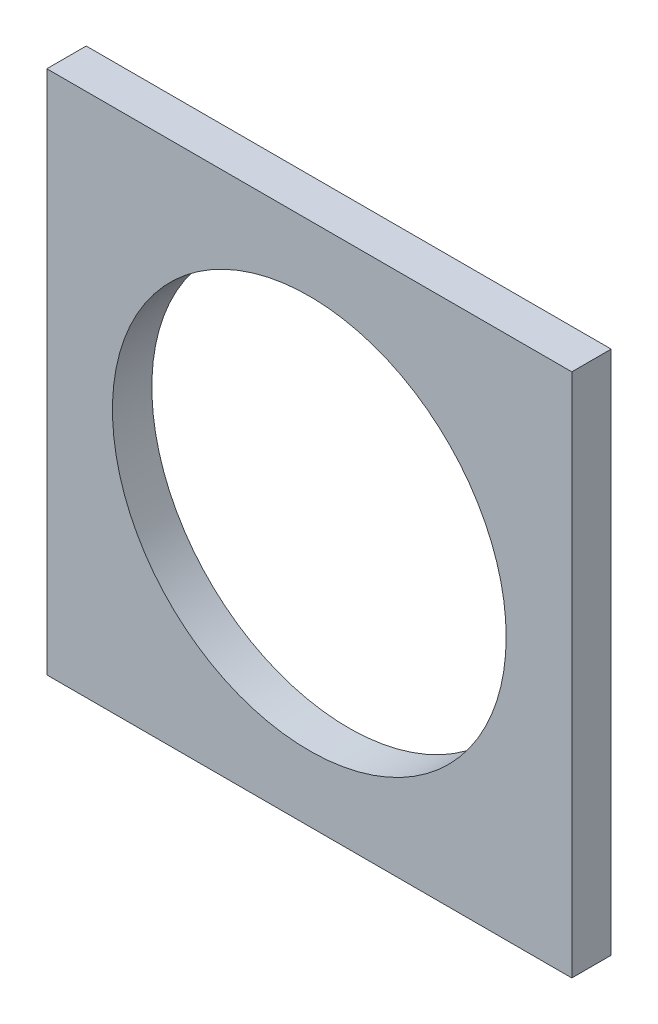
ISO-10303-21;
HEADER;
FILE_DESCRIPTION(('STEP AP214'),'2;1');
FILE_NAME('part.step','',(''),(''),'','','');
FILE_SCHEMA(('AUTOMOTIVE_DESIGN { 1 0 10303 214 1 1 1 1 }'));
ENDSEC;
DATA;
#1=APPLICATION_CONTEXT('core data for automotive mechanical design processes');
#2=APPLICATION_PROTOCOL_DEFINITION('international standard','automotive_design',2000,#1);
#3=PRODUCT_CONTEXT('',#1,'mechanical');
#4=PRODUCT('Part','Part','',(#3));
#5=PRODUCT_RELATED_PRODUCT_CATEGORY('part','',(#4));
#6=PRODUCT_DEFINITION_FORMATION('','',#4);
#7=PRODUCT_DEFINITION_CONTEXT('part definition',#1,'design');
#8=PRODUCT_DEFINITION('design','',#6,#7);
#9=PRODUCT_DEFINITION_SHAPE('','',#8);
#10=(LENGTH_UNIT() NAMED_UNIT(*) SI_UNIT(.MILLI.,.METRE.));
#11=(NAMED_UNIT(*) PLANE_ANGLE_UNIT() SI_UNIT($,.RADIAN.));
#12=(NAMED_UNIT(*) SI_UNIT($,.STERADIAN.) SOLID_ANGLE_UNIT());
#13=UNCERTAINTY_MEASURE_WITH_UNIT(LENGTH_MEASURE(1.E-05),#10,'distance_accuracy_value','');
#14=(GEOMETRIC_REPRESENTATION_CONTEXT(3) GLOBAL_UNCERTAINTY_ASSIGNED_CONTEXT((#13)) GLOBAL_UNIT_ASSIGNED_CONTEXT((#10,
#11,#12)) REPRESENTATION_CONTEXT('',''));
#15=CARTESIAN_POINT('',(0.,0.,0.));
#16=DIRECTION('',(0.,0.,1.));
#17=DIRECTION('',(1.,0.,0.));
#18=AXIS2_PLACEMENT_3D('',#15,#16,#17);
#19=CARTESIAN_POINT('',(20.,20.,3.));
#20=DIRECTION('',(0.,0.,-1.));
#21=DIRECTION('',(-1.,0.,0.));
#22=AXIS2_PLACEMENT_3D('',#19,#20,#21);
#23=PLANE('',#22);
#24=DIRECTION('',(0.,1.,0.));
#25=VECTOR('',#24,1.);
#26=CARTESIAN_POINT('',(20.,-20.,3.));
#27=LINE('',#26,#25);
#28=CARTESIAN_POINT('',(20.,-20.,3.));
#29=VERTEX_POINT('',#28);
#30=CARTESIAN_POINT('',(20.,20.,3.));
#31=VERTEX_POINT('',#30);
#32=EDGE_CURVE('E85',#29,#31,#27,.T.);
#33=ORIENTED_EDGE('',*,*,#32,.T.);
#34=DIRECTION('',(-1.,0.,0.));
#35=VECTOR('',#34,1.);
#36=CARTESIAN_POINT('',(-20.,20.,3.));
#37=LINE('',#36,#35);
#38=CARTESIAN_POINT('',(-20.,20.,3.));
#39=VERTEX_POINT('',#38);
#40=EDGE_CURVE('E80',#31,#39,#37,.T.);
#41=ORIENTED_EDGE('',*,*,#40,.T.);
#42=DIRECTION('',(0.,-1.,0.));
#43=VECTOR('',#42,1.);
#44=CARTESIAN_POINT('',(-20.,-20.,3.));
#45=LINE('',#44,#43);
#46=CARTESIAN_POINT('',(-20.,-20.,3.));
#47=VERTEX_POINT('',#46);
#48=EDGE_CURVE('E83',#39,#47,#45,.T.);
#49=ORIENTED_EDGE('',*,*,#48,.T.);
#50=DIRECTION('',(1.,0.,0.));
#51=VECTOR('',#50,1.);
#52=CARTESIAN_POINT('',(-20.,-20.,3.));
#53=LINE('',#52,#51);
#54=EDGE_CURVE('E50',#47,#29,#53,.T.);
#55=ORIENTED_EDGE('',*,*,#54,.T.);
#56=EDGE_LOOP('',(#33,#41,#49,#55));
#57=FACE_BOUND('',#56,.T.);
#58=CARTESIAN_POINT('',(0.,0.,3.));
#59=DIRECTION('',(0.,0.,1.));
#60=DIRECTION('',(1.,0.,0.));
#61=AXIS2_PLACEMENT_3D('',#58,#59,#60);
#62=CIRCLE('',#61,15.);
#63=CARTESIAN_POINT('',(15.,0.,3.));
#64=VERTEX_POINT('',#63);
#65=EDGE_CURVE('E100',#64,#64,#62,.T.);
#66=ORIENTED_EDGE('',*,*,#65,.F.);
#67=EDGE_LOOP('',(#66));
#68=FACE_BOUND('',#67,.T.);
#69=ADVANCED_FACE('F33',(#57,#68),#23,.F.);
#70=CARTESIAN_POINT('',(20.,20.,0.));
#71=DIRECTION('',(0.,0.,-1.));
#72=DIRECTION('',(-1.,0.,0.));
#73=AXIS2_PLACEMENT_3D('',#70,#71,#72);
#74=PLANE('',#73);
#75=DIRECTION('',(0.,1.,0.));
#76=VECTOR('',#75,1.);
#77=CARTESIAN_POINT('',(20.,-20.,0.));
#78=LINE('',#77,#76);
#79=CARTESIAN_POINT('',(20.,-20.,0.));
#80=VERTEX_POINT('',#79);
#81=CARTESIAN_POINT('',(20.,20.,0.));
#82=VERTEX_POINT('',#81);
#83=EDGE_CURVE('E97',#80,#82,#78,.T.);
#84=ORIENTED_EDGE('',*,*,#83,.F.);
#85=DIRECTION('',(1.,0.,0.));
#86=VECTOR('',#85,1.);
#87=CARTESIAN_POINT('',(-20.,-20.,0.));
#88=LINE('',#87,#86);
#89=CARTESIAN_POINT('',(-20.,-20.,0.));
#90=VERTEX_POINT('',#89);
#91=EDGE_CURVE('E73',#90,#80,#88,.T.);
#92=ORIENTED_EDGE('',*,*,#91,.F.);
#93=DIRECTION('',(0.,-1.,0.));
#94=VECTOR('',#93,1.);
#95=CARTESIAN_POINT('',(-20.,-20.,0.));
#96=LINE('',#95,#94);
#97=CARTESIAN_POINT('',(-20.,20.,0.));
#98=VERTEX_POINT('',#97);
#99=EDGE_CURVE('E67',#98,#90,#96,.T.);
#100=ORIENTED_EDGE('',*,*,#99,.F.);
#101=DIRECTION('',(-1.,0.,0.));
#102=VECTOR('',#101,1.);
#103=CARTESIAN_POINT('',(-20.,20.,0.));
#104=LINE('',#103,#102);
#105=EDGE_CURVE('E89',#82,#98,#104,.T.);
#106=ORIENTED_EDGE('',*,*,#105,.F.);
#107=EDGE_LOOP('',(#84,#92,#100,#106));
#108=FACE_BOUND('',#107,.T.);
#109=CARTESIAN_POINT('',(0.,0.,0.));
#110=DIRECTION('',(0.,0.,1.));
#111=DIRECTION('',(1.,0.,0.));
#112=AXIS2_PLACEMENT_3D('',#109,#110,#111);
#113=CIRCLE('',#112,15.);
#114=CARTESIAN_POINT('',(15.,0.,0.));
#115=VERTEX_POINT('',#114);
#116=EDGE_CURVE('E112',#115,#115,#113,.T.);
#117=ORIENTED_EDGE('',*,*,#116,.T.);
#118=EDGE_LOOP('',(#117));
#119=FACE_BOUND('',#118,.T.);
#120=ADVANCED_FACE('F108',(#108,#119),#74,.T.);
#121=CARTESIAN_POINT('',(20.,-20.,3.));
#122=DIRECTION('',(-1.,0.,0.));
#123=DIRECTION('',(0.,0.,1.));
#124=AXIS2_PLACEMENT_3D('',#121,#122,#123);
#125=PLANE('',#124);
#126=ORIENTED_EDGE('',*,*,#83,.T.);
#127=DIRECTION('',(0.,0.,-1.));
#128=VECTOR('',#127,1.);
#129=CARTESIAN_POINT('',(20.,20.,3.));
#130=LINE('',#129,#128);
#131=EDGE_CURVE('E11',#31,#82,#130,.T.);
#132=ORIENTED_EDGE('',*,*,#131,.F.);
#133=ORIENTED_EDGE('',*,*,#32,.F.);
#134=DIRECTION('',(0.,0.,-1.));
#135=VECTOR('',#134,1.);
#136=CARTESIAN_POINT('',(20.,-20.,3.));
#137=LINE('',#136,#135);
#138=EDGE_CURVE('E93',#29,#80,#137,.T.);
#139=ORIENTED_EDGE('',*,*,#138,.T.);
#140=EDGE_LOOP('',(#126,#132,#133,#139));
#141=FACE_BOUND('',#140,.T.);
#142=ADVANCED_FACE('F35',(#141),#125,.F.);
#143=CARTESIAN_POINT('',(-20.,20.,3.));
#144=DIRECTION('',(0.,-1.,0.));
#145=DIRECTION('',(0.,0.,-1.));
#146=AXIS2_PLACEMENT_3D('',#143,#144,#145);
#147=PLANE('',#146);
#148=ORIENTED_EDGE('',*,*,#105,.T.);
#149=DIRECTION('',(0.,0.,-1.));
#150=VECTOR('',#149,1.);
#151=CARTESIAN_POINT('',(-20.,20.,3.));
#152=LINE('',#151,#150);
#153=EDGE_CURVE('E42',#39,#98,#152,.T.);
#154=ORIENTED_EDGE('',*,*,#153,.F.);
#155=ORIENTED_EDGE('',*,*,#40,.F.);
#156=ORIENTED_EDGE('',*,*,#131,.T.);
#157=EDGE_LOOP('',(#148,#154,#155,#156));
#158=FACE_BOUND('',#157,.T.);
#159=ADVANCED_FACE('F88',(#158),#147,.F.);
#160=CARTESIAN_POINT('',(-20.,-20.,3.));
#161=DIRECTION('',(1.,0.,0.));
#162=DIRECTION('',(0.,0.,-1.));
#163=AXIS2_PLACEMENT_3D('',#160,#161,#162);
#164=PLANE('',#163);
#165=ORIENTED_EDGE('',*,*,#99,.T.);
#166=DIRECTION('',(0.,0.,-1.));
#167=VECTOR('',#166,1.);
#168=CARTESIAN_POINT('',(-20.,-20.,3.));
#169=LINE('',#168,#167);
#170=EDGE_CURVE('E90',#47,#90,#169,.T.);
#171=ORIENTED_EDGE('',*,*,#170,.F.);
#172=ORIENTED_EDGE('',*,*,#48,.F.);
#173=ORIENTED_EDGE('',*,*,#153,.T.);
#174=EDGE_LOOP('',(#165,#171,#172,#173));
#175=FACE_BOUND('',#174,.T.);
#176=ADVANCED_FACE('F91',(#175),#164,.F.);
#177=CARTESIAN_POINT('',(-20.,-20.,3.));
#178=DIRECTION('',(0.,1.,0.));
#179=DIRECTION('',(0.,0.,1.));
#180=AXIS2_PLACEMENT_3D('',#177,#178,#179);
#181=PLANE('',#180);
#182=ORIENTED_EDGE('',*,*,#91,.T.);
#183=ORIENTED_EDGE('',*,*,#138,.F.);
#184=ORIENTED_EDGE('',*,*,#54,.F.);
#185=ORIENTED_EDGE('',*,*,#170,.T.);
#186=EDGE_LOOP('',(#182,#183,#184,#185));
#187=FACE_BOUND('',#186,.T.);
#188=ADVANCED_FACE('F105',(#187),#181,.F.);
#189=CARTESIAN_POINT('',(0.,0.,3.));
#190=DIRECTION('',(0.,0.,-1.));
#191=DIRECTION('',(-1.,0.,0.));
#192=AXIS2_PLACEMENT_3D('',#189,#190,#191);
#193=CYLINDRICAL_SURFACE('',#192,15.);
#194=ORIENTED_EDGE('',*,*,#65,.T.);
#195=EDGE_LOOP('',(#194));
#196=FACE_BOUND('',#195,.T.);
#197=ORIENTED_EDGE('',*,*,#116,.F.);
#198=EDGE_LOOP('',(#197));
#199=FACE_BOUND('',#198,.T.);
#200=ADVANCED_FACE('F118',(#196,#199),#193,.F.);
#201=CLOSED_SHELL('',(#69,#120,#142,#159,#176,#188,#200));
#202=MANIFOLD_SOLID_BREP('B2',#201);
#203=ADVANCED_BREP_SHAPE_REPRESENTATION('',(#18,#202),#14);
#204=SHAPE_DEFINITION_REPRESENTATION(#9,#203);
ENDSEC;
END-ISO-10303-21;
